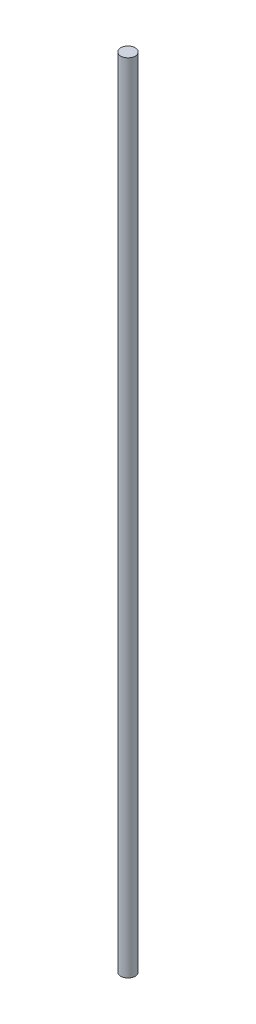
ISO-10303-21;
HEADER;
FILE_DESCRIPTION(('STEP AP214'),'2;1');
FILE_NAME('part.step','',(''),(''),'','','');
FILE_SCHEMA(('AUTOMOTIVE_DESIGN { 1 0 10303 214 1 1 1 1 }'));
ENDSEC;
DATA;
#1=APPLICATION_CONTEXT('core data for automotive mechanical design processes');
#2=APPLICATION_PROTOCOL_DEFINITION('international standard','automotive_design',2000,#1);
#3=PRODUCT_CONTEXT('',#1,'mechanical');
#4=PRODUCT('Part','Part','',(#3));
#5=PRODUCT_RELATED_PRODUCT_CATEGORY('part','',(#4));
#6=PRODUCT_DEFINITION_FORMATION('','',#4);
#7=PRODUCT_DEFINITION_CONTEXT('part definition',#1,'design');
#8=PRODUCT_DEFINITION('design','',#6,#7);
#9=PRODUCT_DEFINITION_SHAPE('','',#8);
#10=(LENGTH_UNIT() NAMED_UNIT(*) SI_UNIT(.MILLI.,.METRE.));
#11=(NAMED_UNIT(*) PLANE_ANGLE_UNIT() SI_UNIT($,.RADIAN.));
#12=(NAMED_UNIT(*) SI_UNIT($,.STERADIAN.) SOLID_ANGLE_UNIT());
#13=UNCERTAINTY_MEASURE_WITH_UNIT(LENGTH_MEASURE(1.E-05),#10,'distance_accuracy_value','');
#14=(GEOMETRIC_REPRESENTATION_CONTEXT(3) GLOBAL_UNCERTAINTY_ASSIGNED_CONTEXT((#13)) GLOBAL_UNIT_ASSIGNED_CONTEXT((#10,
#11,#12)) REPRESENTATION_CONTEXT('',''));
#15=CARTESIAN_POINT('',(0.,0.,0.));
#16=DIRECTION('',(0.,0.,1.));
#17=DIRECTION('',(1.,0.,0.));
#18=AXIS2_PLACEMENT_3D('',#15,#16,#17);
#19=CARTESIAN_POINT('',(0.,11.,0.));
#20=DIRECTION('',(0.,-1.,0.));
#21=DIRECTION('',(0.,0.,-1.));
#22=AXIS2_PLACEMENT_3D('',#19,#20,#21);
#23=CYLINDRICAL_SURFACE('',#22,0.1);
#24=CARTESIAN_POINT('',(0.,11.,0.));
#25=DIRECTION('',(0.,1.,0.));
#26=DIRECTION('',(0.,0.,1.));
#27=AXIS2_PLACEMENT_3D('',#24,#25,#26);
#28=CIRCLE('',#27,0.1);
#29=CARTESIAN_POINT('',(0.,11.,0.1));
#30=VERTEX_POINT('',#29);
#31=EDGE_CURVE('E12',#30,#30,#28,.T.);
#32=ORIENTED_EDGE('',*,*,#31,.F.);
#33=EDGE_LOOP('',(#32));
#34=FACE_BOUND('',#33,.T.);
#35=CARTESIAN_POINT('',(0.,0.,0.));
#36=DIRECTION('',(0.,1.,0.));
#37=DIRECTION('',(0.,0.,1.));
#38=AXIS2_PLACEMENT_3D('',#35,#36,#37);
#39=CIRCLE('',#38,0.1);
#40=CARTESIAN_POINT('',(0.,0.,0.1));
#41=VERTEX_POINT('',#40);
#42=EDGE_CURVE('E46',#41,#41,#39,.T.);
#43=ORIENTED_EDGE('',*,*,#42,.T.);
#44=EDGE_LOOP('',(#43));
#45=FACE_BOUND('',#44,.T.);
#46=ADVANCED_FACE('F43',(#34,#45),#23,.T.);
#47=CARTESIAN_POINT('',(0.,11.,0.));
#48=DIRECTION('',(0.,1.,0.));
#49=DIRECTION('',(0.,0.,1.));
#50=AXIS2_PLACEMENT_3D('',#47,#48,#49);
#51=PLANE('',#50);
#52=ORIENTED_EDGE('',*,*,#31,.T.);
#53=EDGE_LOOP('',(#52));
#54=FACE_BOUND('',#53,.T.);
#55=ADVANCED_FACE('F58',(#54),#51,.T.);
#56=CARTESIAN_POINT('',(0.,0.,0.));
#57=DIRECTION('',(0.,1.,0.));
#58=DIRECTION('',(0.,0.,1.));
#59=AXIS2_PLACEMENT_3D('',#56,#57,#58);
#60=PLANE('',#59);
#61=ORIENTED_EDGE('',*,*,#42,.F.);
#62=EDGE_LOOP('',(#61));
#63=FACE_BOUND('',#62,.T.);
#64=ADVANCED_FACE('F56',(#63),#60,.F.);
#65=CLOSED_SHELL('',(#46,#55,#64));
#66=MANIFOLD_SOLID_BREP('B2',#65);
#67=ADVANCED_BREP_SHAPE_REPRESENTATION('',(#18,#66),#14);
#68=SHAPE_DEFINITION_REPRESENTATION(#9,#67);
ENDSEC;
END-ISO-10303-21;
